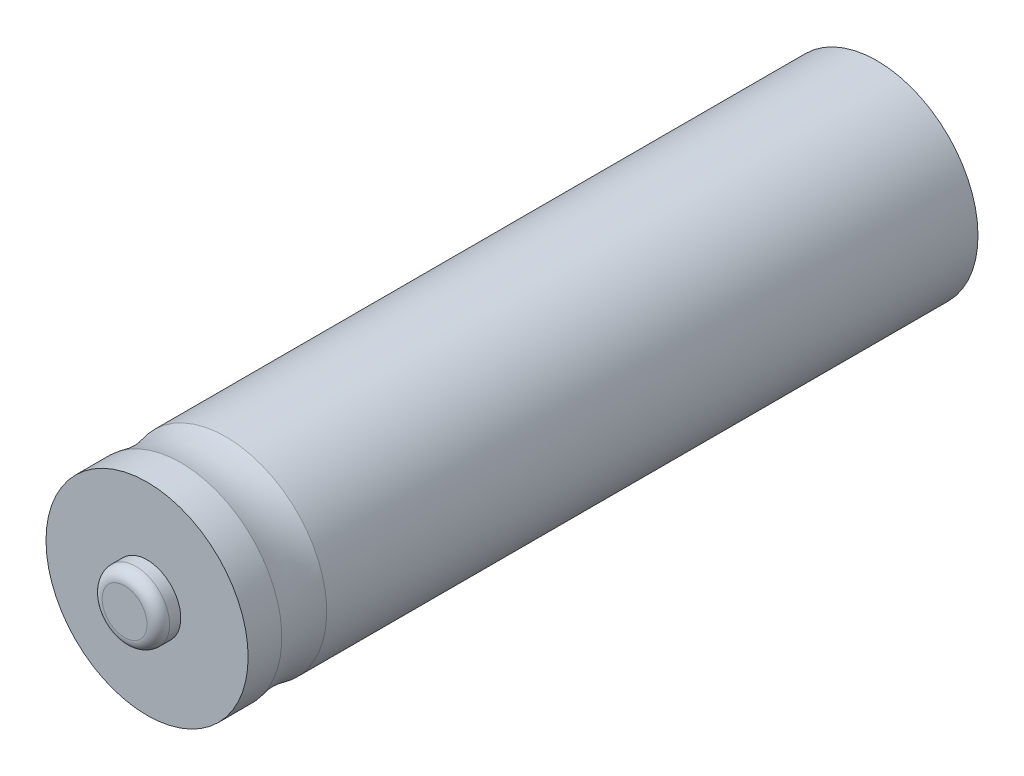
ISO-10303-21;
HEADER;
FILE_DESCRIPTION(('STEP AP214'),'2;1');
FILE_NAME('part.step','',(''),(''),'','','');
FILE_SCHEMA(('AUTOMOTIVE_DESIGN { 1 0 10303 214 1 1 1 1 }'));
ENDSEC;
DATA;
#1=APPLICATION_CONTEXT('core data for automotive mechanical design processes');
#2=APPLICATION_PROTOCOL_DEFINITION('international standard','automotive_design',2000,#1);
#3=PRODUCT_CONTEXT('',#1,'mechanical');
#4=PRODUCT('Part','Part','',(#3));
#5=PRODUCT_RELATED_PRODUCT_CATEGORY('part','',(#4));
#6=PRODUCT_DEFINITION_FORMATION('','',#4);
#7=PRODUCT_DEFINITION_CONTEXT('part definition',#1,'design');
#8=PRODUCT_DEFINITION('design','',#6,#7);
#9=PRODUCT_DEFINITION_SHAPE('','',#8);
#10=(LENGTH_UNIT() NAMED_UNIT(*) SI_UNIT(.MILLI.,.METRE.));
#11=(NAMED_UNIT(*) PLANE_ANGLE_UNIT() SI_UNIT($,.RADIAN.));
#12=(NAMED_UNIT(*) SI_UNIT($,.STERADIAN.) SOLID_ANGLE_UNIT());
#13=UNCERTAINTY_MEASURE_WITH_UNIT(LENGTH_MEASURE(1.E-05),#10,'distance_accuracy_value','');
#14=(GEOMETRIC_REPRESENTATION_CONTEXT(3) GLOBAL_UNCERTAINTY_ASSIGNED_CONTEXT((#13)) GLOBAL_UNIT_ASSIGNED_CONTEXT((#10,
#11,#12)) REPRESENTATION_CONTEXT('',''));
#15=CARTESIAN_POINT('',(0.,0.,0.));
#16=DIRECTION('',(0.,0.,1.));
#17=DIRECTION('',(1.,0.,0.));
#18=AXIS2_PLACEMENT_3D('',#15,#16,#17);
#19=CARTESIAN_POINT('',(0.,0.,32.5));
#20=DIRECTION('',(0.,0.,-1.));
#21=DIRECTION('',(-1.,0.,0.));
#22=AXIS2_PLACEMENT_3D('',#19,#20,#21);
#23=CYLINDRICAL_SURFACE('',#22,9.);
#24=CARTESIAN_POINT('',(0.,0.,29.5));
#25=DIRECTION('',(0.,0.,-1.));
#26=DIRECTION('',(-1.,0.,0.));
#27=AXIS2_PLACEMENT_3D('',#24,#25,#26);
#28=CIRCLE('',#27,9.);
#29=CARTESIAN_POINT('',(-9.,0.,29.5));
#30=VERTEX_POINT('',#29);
#31=EDGE_CURVE('E55',#30,#30,#28,.T.);
#32=ORIENTED_EDGE('',*,*,#31,.F.);
#33=EDGE_LOOP('',(#32));
#34=FACE_BOUND('',#33,.T.);
#35=CARTESIAN_POINT('',(0.,0.,32.5));
#36=DIRECTION('',(0.,0.,1.));
#37=DIRECTION('',(1.,0.,0.));
#38=AXIS2_PLACEMENT_3D('',#35,#36,#37);
#39=CIRCLE('',#38,9.);
#40=CARTESIAN_POINT('',(9.,0.,32.5));
#41=VERTEX_POINT('',#40);
#42=EDGE_CURVE('E68',#41,#41,#39,.T.);
#43=ORIENTED_EDGE('',*,*,#42,.F.);
#44=EDGE_LOOP('',(#43));
#45=FACE_BOUND('',#44,.T.);
#46=ADVANCED_FACE('F37',(#34,#45),#23,.T.);
#47=CARTESIAN_POINT('',(0.,0.,32.5));
#48=DIRECTION('',(0.,0.,1.));
#49=DIRECTION('',(1.,0.,0.));
#50=AXIS2_PLACEMENT_3D('',#47,#48,#49);
#51=PLANE('',#50);
#52=CARTESIAN_POINT('',(0.,0.,32.5));
#53=DIRECTION('',(0.,0.,1.));
#54=DIRECTION('',(1.,0.,0.));
#55=AXIS2_PLACEMENT_3D('',#52,#53,#54);
#56=CIRCLE('',#55,3.);
#57=CARTESIAN_POINT('',(3.,0.,32.5));
#58=VERTEX_POINT('',#57);
#59=EDGE_CURVE('E64',#58,#58,#56,.T.);
#60=ORIENTED_EDGE('',*,*,#59,.F.);
#61=EDGE_LOOP('',(#60));
#62=FACE_BOUND('',#61,.T.);
#63=ORIENTED_EDGE('',*,*,#42,.T.);
#64=EDGE_LOOP('',(#63));
#65=FACE_BOUND('',#64,.T.);
#66=ADVANCED_FACE('F94',(#62,#65),#51,.T.);
#67=CARTESIAN_POINT('',(0.,0.,34.5));
#68=DIRECTION('',(0.,0.,-1.));
#69=DIRECTION('',(-1.,0.,0.));
#70=AXIS2_PLACEMENT_3D('',#67,#68,#69);
#71=CYLINDRICAL_SURFACE('',#70,3.);
#72=CARTESIAN_POINT('',(0.,0.,33.5));
#73=DIRECTION('',(0.,0.,1.));
#74=DIRECTION('',(1.,0.,0.));
#75=AXIS2_PLACEMENT_3D('',#72,#73,#74);
#76=CIRCLE('',#75,3.);
#77=CARTESIAN_POINT('',(3.,0.,33.5));
#78=VERTEX_POINT('',#77);
#79=EDGE_CURVE('E41',#78,#78,#76,.F.);
#80=ORIENTED_EDGE('',*,*,#79,.T.);
#81=EDGE_LOOP('',(#80));
#82=FACE_BOUND('',#81,.T.);
#83=ORIENTED_EDGE('',*,*,#59,.T.);
#84=EDGE_LOOP('',(#83));
#85=FACE_BOUND('',#84,.T.);
#86=ADVANCED_FACE('F90',(#82,#85),#71,.T.);
#87=CARTESIAN_POINT('',(0.,0.,34.5));
#88=DIRECTION('',(0.,0.,1.));
#89=DIRECTION('',(1.,0.,0.));
#90=AXIS2_PLACEMENT_3D('',#87,#88,#89);
#91=PLANE('',#90);
#92=CARTESIAN_POINT('',(0.,0.,34.5));
#93=DIRECTION('',(0.,0.,1.));
#94=DIRECTION('',(1.,0.,0.));
#95=AXIS2_PLACEMENT_3D('',#92,#93,#94);
#96=CIRCLE('',#95,2.);
#97=CARTESIAN_POINT('',(2.,0.,34.5));
#98=VERTEX_POINT('',#97);
#99=EDGE_CURVE('E51',#98,#98,#96,.T.);
#100=ORIENTED_EDGE('',*,*,#99,.T.);
#101=EDGE_LOOP('',(#100));
#102=FACE_BOUND('',#101,.T.);
#103=ADVANCED_FACE('F78',(#102),#91,.T.);
#104=CARTESIAN_POINT('',(0.,0.,33.5));
#105=DIRECTION('',(0.,0.,1.));
#106=DIRECTION('',(1.,0.,0.));
#107=AXIS2_PLACEMENT_3D('',#104,#105,#106);
#108=TOROIDAL_SURFACE('',#107,2.,1.);
#109=ORIENTED_EDGE('',*,*,#79,.F.);
#110=EDGE_LOOP('',(#109));
#111=FACE_BOUND('',#110,.T.);
#112=ORIENTED_EDGE('',*,*,#99,.F.);
#113=EDGE_LOOP('',(#112));
#114=FACE_BOUND('',#113,.T.);
#115=ADVANCED_FACE('F39',(#111,#114),#108,.T.);
#116=CARTESIAN_POINT('',(0.,0.,27.5));
#117=DIRECTION('',(0.,0.,-1.));
#118=DIRECTION('',(-1.,0.,0.));
#119=AXIS2_PLACEMENT_3D('',#116,#117,#118);
#120=TOROIDAL_SURFACE('',#119,16.5443698743945,7.80496744398532);
#121=CARTESIAN_POINT('',(0.,0.,25.5));
#122=DIRECTION('',(0.,0.,-1.));
#123=DIRECTION('',(-1.,0.,0.));
#124=AXIS2_PLACEMENT_3D('',#121,#122,#123);
#125=CIRCLE('',#124,9.);
#126=CARTESIAN_POINT('',(-9.,0.,25.5));
#127=VERTEX_POINT('',#126);
#128=EDGE_CURVE('E59',#127,#127,#125,.T.);
#129=ORIENTED_EDGE('',*,*,#128,.F.);
#130=EDGE_LOOP('',(#129));
#131=FACE_BOUND('',#130,.T.);
#132=ORIENTED_EDGE('',*,*,#31,.T.);
#133=EDGE_LOOP('',(#132));
#134=FACE_BOUND('',#133,.T.);
#135=ADVANCED_FACE('F81',(#131,#134),#120,.F.);
#136=CARTESIAN_POINT('',(0.,0.,-32.5));
#137=DIRECTION('',(0.,0.,1.));
#138=DIRECTION('',(1.,0.,0.));
#139=AXIS2_PLACEMENT_3D('',#136,#137,#138);
#140=PLANE('',#139);
#141=CARTESIAN_POINT('',(0.,0.,-32.5));
#142=DIRECTION('',(0.,0.,-1.));
#143=DIRECTION('',(-1.,0.,0.));
#144=AXIS2_PLACEMENT_3D('',#141,#142,#143);
#145=CIRCLE('',#144,5.5);
#146=CARTESIAN_POINT('',(-5.5,0.,-32.5));
#147=VERTEX_POINT('',#146);
#148=EDGE_CURVE('E10',#147,#147,#145,.T.);
#149=ORIENTED_EDGE('',*,*,#148,.F.);
#150=EDGE_LOOP('',(#149));
#151=FACE_BOUND('',#150,.T.);
#152=CARTESIAN_POINT('',(0.,0.,-32.5));
#153=DIRECTION('',(0.,0.,1.));
#154=DIRECTION('',(1.,0.,0.));
#155=AXIS2_PLACEMENT_3D('',#152,#153,#154);
#156=CIRCLE('',#155,9.);
#157=CARTESIAN_POINT('',(9.,0.,-32.5));
#158=VERTEX_POINT('',#157);
#159=EDGE_CURVE('E63',#158,#158,#156,.T.);
#160=ORIENTED_EDGE('',*,*,#159,.F.);
#161=EDGE_LOOP('',(#160));
#162=FACE_BOUND('',#161,.T.);
#163=ADVANCED_FACE('F87',(#151,#162),#140,.F.);
#164=ORIENTED_EDGE('',*,*,#128,.T.);
#165=EDGE_LOOP('',(#164));
#166=FACE_BOUND('',#165,.T.);
#167=ORIENTED_EDGE('',*,*,#159,.T.);
#168=EDGE_LOOP('',(#167));
#169=FACE_BOUND('',#168,.T.);
#170=ADVANCED_FACE('F96',(#166,#169),#23,.T.);
#171=CARTESIAN_POINT('',(0.,0.,-32.9));
#172=DIRECTION('',(0.,0.,1.));
#173=DIRECTION('',(1.,0.,0.));
#174=AXIS2_PLACEMENT_3D('',#171,#172,#173);
#175=CYLINDRICAL_SURFACE('',#174,5.5);
#176=CARTESIAN_POINT('',(0.,0.,-32.9));
#177=DIRECTION('',(0.,0.,-1.));
#178=DIRECTION('',(-1.,0.,0.));
#179=AXIS2_PLACEMENT_3D('',#176,#177,#178);
#180=CIRCLE('',#179,5.5);
#181=CARTESIAN_POINT('',(-5.5,0.,-32.9));
#182=VERTEX_POINT('',#181);
#183=EDGE_CURVE('E54',#182,#182,#180,.T.);
#184=ORIENTED_EDGE('',*,*,#183,.F.);
#185=EDGE_LOOP('',(#184));
#186=FACE_BOUND('',#185,.T.);
#187=ORIENTED_EDGE('',*,*,#148,.T.);
#188=EDGE_LOOP('',(#187));
#189=FACE_BOUND('',#188,.T.);
#190=ADVANCED_FACE('F106',(#186,#189),#175,.T.);
#191=CARTESIAN_POINT('',(0.,0.,-32.9));
#192=DIRECTION('',(0.,0.,-1.));
#193=DIRECTION('',(-1.,0.,0.));
#194=AXIS2_PLACEMENT_3D('',#191,#192,#193);
#195=PLANE('',#194);
#196=ORIENTED_EDGE('',*,*,#183,.T.);
#197=EDGE_LOOP('',(#196));
#198=FACE_BOUND('',#197,.T.);
#199=ADVANCED_FACE('F112',(#198),#195,.T.);
#200=CLOSED_SHELL('',(#46,#66,#86,#103,#115,#135,#163,#170,#190,#199));
#201=MANIFOLD_SOLID_BREP('B2',#200);
#202=ADVANCED_BREP_SHAPE_REPRESENTATION('',(#18,#201),#14);
#203=SHAPE_DEFINITION_REPRESENTATION(#9,#202);
ENDSEC;
END-ISO-10303-21;
